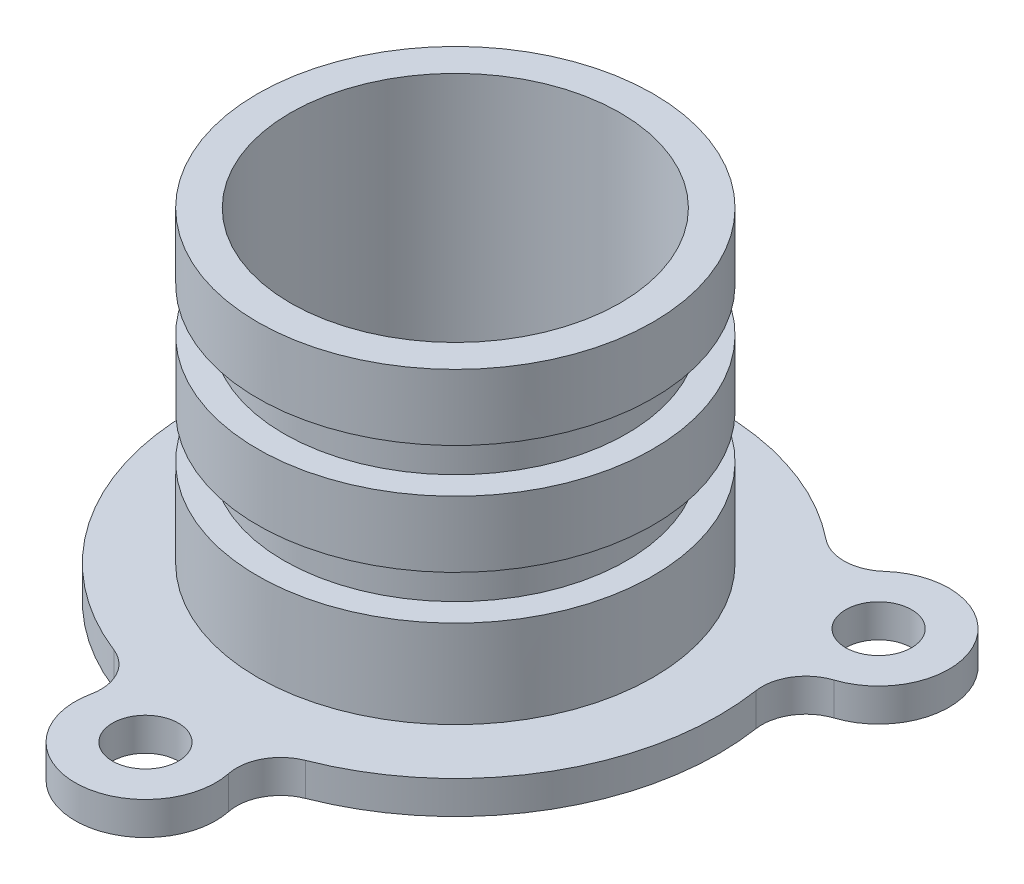
ISO-10303-21;
HEADER;
FILE_DESCRIPTION(('STEP AP214'),'2;1');
FILE_NAME('part.step','',(''),(''),'','','');
FILE_SCHEMA(('AUTOMOTIVE_DESIGN { 1 0 10303 214 1 1 1 1 }'));
ENDSEC;
DATA;
#1=APPLICATION_CONTEXT('core data for automotive mechanical design processes');
#2=APPLICATION_PROTOCOL_DEFINITION('international standard','automotive_design',2000,#1);
#3=PRODUCT_CONTEXT('',#1,'mechanical');
#4=PRODUCT('Part','Part','',(#3));
#5=PRODUCT_RELATED_PRODUCT_CATEGORY('part','',(#4));
#6=PRODUCT_DEFINITION_FORMATION('','',#4);
#7=PRODUCT_DEFINITION_CONTEXT('part definition',#1,'design');
#8=PRODUCT_DEFINITION('design','',#6,#7);
#9=PRODUCT_DEFINITION_SHAPE('','',#8);
#10=(LENGTH_UNIT() NAMED_UNIT(*) SI_UNIT(.MILLI.,.METRE.));
#11=(NAMED_UNIT(*) PLANE_ANGLE_UNIT() SI_UNIT($,.RADIAN.));
#12=(NAMED_UNIT(*) SI_UNIT($,.STERADIAN.) SOLID_ANGLE_UNIT());
#13=UNCERTAINTY_MEASURE_WITH_UNIT(LENGTH_MEASURE(1.E-05),#10,'distance_accuracy_value','');
#14=(GEOMETRIC_REPRESENTATION_CONTEXT(3) GLOBAL_UNCERTAINTY_ASSIGNED_CONTEXT((#13)) GLOBAL_UNIT_ASSIGNED_CONTEXT((#10,
#11,#12)) REPRESENTATION_CONTEXT('',''));
#15=CARTESIAN_POINT('',(0.,0.,0.));
#16=DIRECTION('',(0.,0.,1.));
#17=DIRECTION('',(1.,0.,0.));
#18=AXIS2_PLACEMENT_3D('',#15,#16,#17);
#19=CARTESIAN_POINT('',(0.,77.5,0.));
#20=DIRECTION('',(0.,-1.,0.));
#21=DIRECTION('',(0.,0.,-1.));
#22=AXIS2_PLACEMENT_3D('',#19,#20,#21);
#23=CYLINDRICAL_SURFACE('',#22,45.);
#24=CARTESIAN_POINT('',(0.,27.5,0.));
#25=DIRECTION('',(0.,-1.,0.));
#26=DIRECTION('',(0.,0.,-1.));
#27=AXIS2_PLACEMENT_3D('',#24,#25,#26);
#28=CIRCLE('',#27,45.);
#29=CARTESIAN_POINT('',(0.,27.5,-45.));
#30=VERTEX_POINT('',#29);
#31=EDGE_CURVE('E346',#30,#30,#28,.T.);
#32=ORIENTED_EDGE('',*,*,#31,.T.);
#33=EDGE_LOOP('',(#32));
#34=FACE_BOUND('',#33,.T.);
#35=CARTESIAN_POINT('',(0.,7.5,0.));
#36=DIRECTION('',(0.,1.,0.));
#37=DIRECTION('',(0.,0.,1.));
#38=AXIS2_PLACEMENT_3D('',#35,#36,#37);
#39=CIRCLE('',#38,45.);
#40=CARTESIAN_POINT('',(0.,7.5,45.));
#41=VERTEX_POINT('',#40);
#42=EDGE_CURVE('E367',#41,#41,#39,.T.);
#43=ORIENTED_EDGE('',*,*,#42,.T.);
#44=EDGE_LOOP('',(#43));
#45=FACE_BOUND('',#44,.T.);
#46=ADVANCED_FACE('F45',(#34,#45),#23,.T.);
#47=CARTESIAN_POINT('',(-12.7278128591999,7.5,32.6037234042553));
#48=DIRECTION('',(0.,1.,0.));
#49=DIRECTION('',(0.,0.,1.));
#50=AXIS2_PLACEMENT_3D('',#47,#48,#49);
#51=PLANE('',#50);
#52=ORIENTED_EDGE('',*,*,#42,.F.);
#53=EDGE_LOOP('',(#52));
#54=FACE_BOUND('',#53,.T.);
#55=CARTESIAN_POINT('',(61.0547909668029,7.5,-35.25));
#56=DIRECTION('',(0.,1.,0.));
#57=DIRECTION('',(0.,0.,1.));
#58=AXIS2_PLACEMENT_3D('',#55,#56,#57);
#59=CIRCLE('',#58,7.5);
#60=CARTESIAN_POINT('',(61.0547909668029,7.5,-27.75));
#61=VERTEX_POINT('',#60);
#62=EDGE_CURVE('E380',#61,#61,#59,.T.);
#63=ORIENTED_EDGE('',*,*,#62,.F.);
#64=EDGE_LOOP('',(#63));
#65=FACE_BOUND('',#64,.T.);
#66=CARTESIAN_POINT('',(0.,7.5,0.));
#67=DIRECTION('',(0.,1.,0.));
#68=DIRECTION('',(0.,0.,1.));
#69=AXIS2_PLACEMENT_3D('',#66,#67,#68);
#70=CIRCLE('',#69,60.);
#71=CARTESIAN_POINT('',(-59.313529981108,7.5,-9.05014702533651));
#72=VERTEX_POINT('',#71);
#73=CARTESIAN_POINT('',(-21.8191077586284,7.5,55.8920972644376));
#74=VERTEX_POINT('',#73);
#75=EDGE_CURVE('E207',#72,#74,#70,.T.);
#76=ORIENTED_EDGE('',*,*,#75,.T.);
#77=CARTESIAN_POINT('',(-25.4556257183998,7.5,65.2074468085106));
#78=DIRECTION('',(0.,-1.,0.));
#79=DIRECTION('',(0.,0.,-1.));
#80=AXIS2_PLACEMENT_3D('',#77,#78,#79);
#81=CIRCLE('',#80,9.99999999999999);
#82=CARTESIAN_POINT('',(-15.6650004420922,7.5,67.2430441898527));
#83=VERTEX_POINT('',#82);
#84=EDGE_CURVE('E118',#74,#83,#81,.T.);
#85=ORIENTED_EDGE('',*,*,#84,.T.);
#86=CARTESIAN_POINT('',(0.,7.5,70.5));
#87=DIRECTION('',(0.,1.,0.));
#88=DIRECTION('',(0.,0.,1.));
#89=AXIS2_PLACEMENT_3D('',#86,#87,#88);
#90=CIRCLE('',#89,16.);
#91=CARTESIAN_POINT('',(15.6650004420922,7.5,67.2430441898527));
#92=VERTEX_POINT('',#91);
#93=EDGE_CURVE('E244',#83,#92,#90,.T.);
#94=ORIENTED_EDGE('',*,*,#93,.T.);
#95=CARTESIAN_POINT('',(25.4556257183998,7.5,65.2074468085106));
#96=DIRECTION('',(0.,-1.,0.));
#97=DIRECTION('',(0.,0.,1.));
#98=AXIS2_PLACEMENT_3D('',#95,#96,#97);
#99=CIRCLE('',#98,10.);
#100=CARTESIAN_POINT('',(21.8191077586284,7.5,55.8920972644377));
#101=VERTEX_POINT('',#100);
#102=EDGE_CURVE('E264',#92,#101,#99,.T.);
#103=ORIENTED_EDGE('',*,*,#102,.T.);
#104=CARTESIAN_POINT('',(0.,7.5,0.));
#105=DIRECTION('',(0.,1.,0.));
#106=DIRECTION('',(0.,0.,1.));
#107=AXIS2_PLACEMENT_3D('',#104,#105,#106);
#108=CIRCLE('',#107,60.);
#109=CARTESIAN_POINT('',(59.3135299811079,7.5,-9.05014702533651));
#110=VERTEX_POINT('',#109);
#111=EDGE_CURVE('E260',#101,#110,#108,.T.);
#112=ORIENTED_EDGE('',*,*,#111,.T.);
#113=CARTESIAN_POINT('',(69.1991183112926,7.5,-10.5585048628926));
#114=DIRECTION('',(0.,-1.,0.));
#115=DIRECTION('',(0.,0.,-1.));
#116=AXIS2_PLACEMENT_3D('',#113,#114,#115);
#117=CIRCLE('',#116,10.);
#118=CARTESIAN_POINT('',(66.0666847172581,7.5,-20.0552337617801));
#119=VERTEX_POINT('',#118);
#120=EDGE_CURVE('E263',#110,#119,#117,.T.);
#121=ORIENTED_EDGE('',*,*,#120,.T.);
#122=CARTESIAN_POINT('',(61.0547909668029,7.5,-35.25));
#123=DIRECTION('',(0.,1.,0.));
#124=DIRECTION('',(0.,0.,1.));
#125=AXIS2_PLACEMENT_3D('',#122,#123,#124);
#126=CIRCLE('',#125,16.);
#127=CARTESIAN_POINT('',(50.401684275166,7.5,-47.1878104280726));
#128=VERTEX_POINT('',#127);
#129=EDGE_CURVE('E268',#119,#128,#126,.T.);
#130=ORIENTED_EDGE('',*,*,#129,.T.);
#131=CARTESIAN_POINT('',(43.7434925928929,7.5,-54.648941945618));
#132=DIRECTION('',(0.,-1.,0.));
#133=DIRECTION('',(0.,0.,1.));
#134=AXIS2_PLACEMENT_3D('',#131,#132,#133);
#135=CIRCLE('',#134,10.);
#136=CARTESIAN_POINT('',(37.4944222224796,7.5,-46.8419502391012));
#137=VERTEX_POINT('',#136);
#138=EDGE_CURVE('E275',#128,#137,#135,.T.);
#139=ORIENTED_EDGE('',*,*,#138,.T.);
#140=CARTESIAN_POINT('',(0.,7.5,0.));
#141=DIRECTION('',(0.,1.,0.));
#142=DIRECTION('',(0.,0.,1.));
#143=AXIS2_PLACEMENT_3D('',#140,#141,#142);
#144=CIRCLE('',#143,60.);
#145=CARTESIAN_POINT('',(-37.4944222224796,7.5,-46.8419502391011));
#146=VERTEX_POINT('',#145);
#147=EDGE_CURVE('E150',#137,#146,#144,.T.);
#148=ORIENTED_EDGE('',*,*,#147,.T.);
#149=CARTESIAN_POINT('',(-43.7434925928929,7.5,-54.648941945618));
#150=DIRECTION('',(0.,-1.,0.));
#151=DIRECTION('',(0.,0.,-1.));
#152=AXIS2_PLACEMENT_3D('',#149,#150,#151);
#153=CIRCLE('',#152,10.);
#154=CARTESIAN_POINT('',(-50.401684275166,7.5,-47.1878104280726));
#155=VERTEX_POINT('',#154);
#156=EDGE_CURVE('E143',#146,#155,#153,.T.);
#157=ORIENTED_EDGE('',*,*,#156,.T.);
#158=CARTESIAN_POINT('',(-61.0547909668029,7.5,-35.25));
#159=DIRECTION('',(0.,1.,0.));
#160=DIRECTION('',(0.,0.,1.));
#161=AXIS2_PLACEMENT_3D('',#158,#159,#160);
#162=CIRCLE('',#161,16.);
#163=CARTESIAN_POINT('',(-66.0666847172581,7.5,-20.0552337617801));
#164=VERTEX_POINT('',#163);
#165=EDGE_CURVE('E148',#155,#164,#162,.T.);
#166=ORIENTED_EDGE('',*,*,#165,.T.);
#167=CARTESIAN_POINT('',(-69.1991183112926,7.5,-10.5585048628926));
#168=DIRECTION('',(0.,-1.,0.));
#169=DIRECTION('',(0.,0.,1.));
#170=AXIS2_PLACEMENT_3D('',#167,#168,#169);
#171=CIRCLE('',#170,10.);
#172=EDGE_CURVE('E63',#164,#72,#171,.T.);
#173=ORIENTED_EDGE('',*,*,#172,.T.);
#174=EDGE_LOOP('',(#76,#85,#94,#103,#112,#121,#130,#139,#148,#157,#166,#173));
#175=FACE_BOUND('',#174,.T.);
#176=CARTESIAN_POINT('',(-61.0547909668029,7.5,-35.25));
#177=DIRECTION('',(0.,1.,0.));
#178=DIRECTION('',(0.,0.,1.));
#179=AXIS2_PLACEMENT_3D('',#176,#177,#178);
#180=CIRCLE('',#179,7.5);
#181=CARTESIAN_POINT('',(-61.0547909668029,7.5,-27.75));
#182=VERTEX_POINT('',#181);
#183=EDGE_CURVE('E177',#182,#182,#180,.T.);
#184=ORIENTED_EDGE('',*,*,#183,.F.);
#185=EDGE_LOOP('',(#184));
#186=FACE_BOUND('',#185,.T.);
#187=CARTESIAN_POINT('',(0.,7.5,70.5));
#188=DIRECTION('',(0.,1.,0.));
#189=DIRECTION('',(0.,0.,1.));
#190=AXIS2_PLACEMENT_3D('',#187,#188,#189);
#191=CIRCLE('',#190,7.5);
#192=CARTESIAN_POINT('',(0.,7.5,78.));
#193=VERTEX_POINT('',#192);
#194=EDGE_CURVE('E372',#193,#193,#191,.T.);
#195=ORIENTED_EDGE('',*,*,#194,.F.);
#196=EDGE_LOOP('',(#195));
#197=FACE_BOUND('',#196,.T.);
#198=ADVANCED_FACE('F145',(#54,#65,#175,#186,#197),#51,.T.);
#199=CARTESIAN_POINT('',(-12.7278128591999,0.,32.6037234042553));
#200=DIRECTION('',(0.,1.,0.));
#201=DIRECTION('',(0.,0.,1.));
#202=AXIS2_PLACEMENT_3D('',#199,#200,#201);
#203=PLANE('',#202);
#204=CARTESIAN_POINT('',(0.,0.,0.));
#205=DIRECTION('',(0.,1.,0.));
#206=DIRECTION('',(0.,0.,1.));
#207=AXIS2_PLACEMENT_3D('',#204,#205,#206);
#208=CIRCLE('',#207,37.5);
#209=CARTESIAN_POINT('',(0.,0.,37.5));
#210=VERTEX_POINT('',#209);
#211=EDGE_CURVE('E354',#210,#210,#208,.T.);
#212=ORIENTED_EDGE('',*,*,#211,.T.);
#213=EDGE_LOOP('',(#212));
#214=FACE_BOUND('',#213,.T.);
#215=CARTESIAN_POINT('',(0.,0.,0.));
#216=DIRECTION('',(0.,1.,0.));
#217=DIRECTION('',(0.,0.,1.));
#218=AXIS2_PLACEMENT_3D('',#215,#216,#217);
#219=CIRCLE('',#218,60.);
#220=CARTESIAN_POINT('',(-59.313529981108,0.,-9.05014702533651));
#221=VERTEX_POINT('',#220);
#222=CARTESIAN_POINT('',(-21.8191077586284,0.,55.8920972644376));
#223=VERTEX_POINT('',#222);
#224=EDGE_CURVE('E172',#221,#223,#219,.T.);
#225=ORIENTED_EDGE('',*,*,#224,.F.);
#226=CARTESIAN_POINT('',(-69.1991183112926,0.,-10.5585048628926));
#227=DIRECTION('',(0.,-1.,0.));
#228=DIRECTION('',(0.,0.,1.));
#229=AXIS2_PLACEMENT_3D('',#226,#227,#228);
#230=CIRCLE('',#229,10.);
#231=CARTESIAN_POINT('',(-66.0666847172581,0.,-20.0552337617801));
#232=VERTEX_POINT('',#231);
#233=EDGE_CURVE('E110',#232,#221,#230,.T.);
#234=ORIENTED_EDGE('',*,*,#233,.F.);
#235=CARTESIAN_POINT('',(-61.0547909668029,0.,-35.25));
#236=DIRECTION('',(0.,1.,0.));
#237=DIRECTION('',(0.,0.,1.));
#238=AXIS2_PLACEMENT_3D('',#235,#236,#237);
#239=CIRCLE('',#238,16.);
#240=CARTESIAN_POINT('',(-50.401684275166,0.,-47.1878104280726));
#241=VERTEX_POINT('',#240);
#242=EDGE_CURVE('E104',#241,#232,#239,.T.);
#243=ORIENTED_EDGE('',*,*,#242,.F.);
#244=CARTESIAN_POINT('',(-43.7434925928929,0.,-54.648941945618));
#245=DIRECTION('',(0.,-1.,0.));
#246=DIRECTION('',(0.,0.,-1.));
#247=AXIS2_PLACEMENT_3D('',#244,#245,#246);
#248=CIRCLE('',#247,10.);
#249=CARTESIAN_POINT('',(-37.4944222224796,0.,-46.8419502391011));
#250=VERTEX_POINT('',#249);
#251=EDGE_CURVE('E159',#250,#241,#248,.T.);
#252=ORIENTED_EDGE('',*,*,#251,.F.);
#253=CARTESIAN_POINT('',(0.,0.,0.));
#254=DIRECTION('',(0.,1.,0.));
#255=DIRECTION('',(0.,0.,1.));
#256=AXIS2_PLACEMENT_3D('',#253,#254,#255);
#257=CIRCLE('',#256,60.);
#258=CARTESIAN_POINT('',(37.4944222224796,0.,-46.8419502391012));
#259=VERTEX_POINT('',#258);
#260=EDGE_CURVE('E198',#259,#250,#257,.T.);
#261=ORIENTED_EDGE('',*,*,#260,.F.);
#262=CARTESIAN_POINT('',(43.7434925928929,0.,-54.648941945618));
#263=DIRECTION('',(0.,-1.,0.));
#264=DIRECTION('',(0.,0.,1.));
#265=AXIS2_PLACEMENT_3D('',#262,#263,#264);
#266=CIRCLE('',#265,10.);
#267=CARTESIAN_POINT('',(50.401684275166,0.,-47.1878104280726));
#268=VERTEX_POINT('',#267);
#269=EDGE_CURVE('E195',#268,#259,#266,.T.);
#270=ORIENTED_EDGE('',*,*,#269,.F.);
#271=CARTESIAN_POINT('',(61.0547909668029,0.,-35.25));
#272=DIRECTION('',(0.,1.,0.));
#273=DIRECTION('',(0.,0.,1.));
#274=AXIS2_PLACEMENT_3D('',#271,#272,#273);
#275=CIRCLE('',#274,16.);
#276=CARTESIAN_POINT('',(66.0666847172581,0.,-20.0552337617801));
#277=VERTEX_POINT('',#276);
#278=EDGE_CURVE('E192',#277,#268,#275,.T.);
#279=ORIENTED_EDGE('',*,*,#278,.F.);
#280=CARTESIAN_POINT('',(69.1991183112926,0.,-10.5585048628926));
#281=DIRECTION('',(0.,-1.,0.));
#282=DIRECTION('',(0.,0.,-1.));
#283=AXIS2_PLACEMENT_3D('',#280,#281,#282);
#284=CIRCLE('',#283,10.);
#285=CARTESIAN_POINT('',(59.3135299811079,0.,-9.05014702533651));
#286=VERTEX_POINT('',#285);
#287=EDGE_CURVE('E189',#286,#277,#284,.T.);
#288=ORIENTED_EDGE('',*,*,#287,.F.);
#289=CARTESIAN_POINT('',(0.,0.,0.));
#290=DIRECTION('',(0.,1.,0.));
#291=DIRECTION('',(0.,0.,1.));
#292=AXIS2_PLACEMENT_3D('',#289,#290,#291);
#293=CIRCLE('',#292,60.);
#294=CARTESIAN_POINT('',(21.8191077586284,0.,55.8920972644377));
#295=VERTEX_POINT('',#294);
#296=EDGE_CURVE('E186',#295,#286,#293,.T.);
#297=ORIENTED_EDGE('',*,*,#296,.F.);
#298=CARTESIAN_POINT('',(25.4556257183998,0.,65.2074468085106));
#299=DIRECTION('',(0.,-1.,0.));
#300=DIRECTION('',(0.,0.,1.));
#301=AXIS2_PLACEMENT_3D('',#298,#299,#300);
#302=CIRCLE('',#301,10.);
#303=CARTESIAN_POINT('',(15.6650004420922,0.,67.2430441898527));
#304=VERTEX_POINT('',#303);
#305=EDGE_CURVE('E183',#304,#295,#302,.T.);
#306=ORIENTED_EDGE('',*,*,#305,.F.);
#307=CARTESIAN_POINT('',(0.,0.,70.5));
#308=DIRECTION('',(0.,1.,0.));
#309=DIRECTION('',(0.,0.,1.));
#310=AXIS2_PLACEMENT_3D('',#307,#308,#309);
#311=CIRCLE('',#310,16.);
#312=CARTESIAN_POINT('',(-15.6650004420922,0.,67.2430441898527));
#313=VERTEX_POINT('',#312);
#314=EDGE_CURVE('E180',#313,#304,#311,.T.);
#315=ORIENTED_EDGE('',*,*,#314,.F.);
#316=CARTESIAN_POINT('',(-25.4556257183998,0.,65.2074468085106));
#317=DIRECTION('',(0.,-1.,0.));
#318=DIRECTION('',(0.,0.,-1.));
#319=AXIS2_PLACEMENT_3D('',#316,#317,#318);
#320=CIRCLE('',#319,9.99999999999999);
#321=EDGE_CURVE('E176',#223,#313,#320,.T.);
#322=ORIENTED_EDGE('',*,*,#321,.F.);
#323=EDGE_LOOP('',(#225,#234,#243,#252,#261,#270,#279,#288,#297,#306,#315,#322));
#324=FACE_BOUND('',#323,.T.);
#325=CARTESIAN_POINT('',(-61.0547909668029,0.,-35.25));
#326=DIRECTION('',(0.,1.,0.));
#327=DIRECTION('',(0.,0.,1.));
#328=AXIS2_PLACEMENT_3D('',#325,#326,#327);
#329=CIRCLE('',#328,7.5);
#330=CARTESIAN_POINT('',(-61.0547909668029,0.,-27.75));
#331=VERTEX_POINT('',#330);
#332=EDGE_CURVE('E384',#331,#331,#329,.T.);
#333=ORIENTED_EDGE('',*,*,#332,.T.);
#334=EDGE_LOOP('',(#333));
#335=FACE_BOUND('',#334,.T.);
#336=CARTESIAN_POINT('',(61.0547909668029,0.,-35.25));
#337=DIRECTION('',(0.,1.,0.));
#338=DIRECTION('',(0.,0.,1.));
#339=AXIS2_PLACEMENT_3D('',#336,#337,#338);
#340=CIRCLE('',#339,7.5);
#341=CARTESIAN_POINT('',(61.0547909668029,0.,-27.75));
#342=VERTEX_POINT('',#341);
#343=EDGE_CURVE('E376',#342,#342,#340,.T.);
#344=ORIENTED_EDGE('',*,*,#343,.T.);
#345=EDGE_LOOP('',(#344));
#346=FACE_BOUND('',#345,.T.);
#347=CARTESIAN_POINT('',(0.,0.,70.5));
#348=DIRECTION('',(0.,1.,0.));
#349=DIRECTION('',(0.,0.,1.));
#350=AXIS2_PLACEMENT_3D('',#347,#348,#349);
#351=CIRCLE('',#350,7.5);
#352=CARTESIAN_POINT('',(0.,0.,78.));
#353=VERTEX_POINT('',#352);
#354=EDGE_CURVE('E366',#353,#353,#351,.T.);
#355=ORIENTED_EDGE('',*,*,#354,.T.);
#356=EDGE_LOOP('',(#355));
#357=FACE_BOUND('',#356,.T.);
#358=ADVANCED_FACE('F248',(#214,#324,#335,#346,#357),#203,.F.);
#359=CARTESIAN_POINT('',(0.,7.5,0.));
#360=DIRECTION('',(0.,-1.,0.));
#361=DIRECTION('',(0.,0.,-1.));
#362=AXIS2_PLACEMENT_3D('',#359,#360,#361);
#363=CYLINDRICAL_SURFACE('',#362,60.);
#364=ORIENTED_EDGE('',*,*,#224,.T.);
#365=DIRECTION('',(0.,-1.,0.));
#366=VECTOR('',#365,1.);
#367=CARTESIAN_POINT('',(-21.8191077586284,7.5,55.8920972644376));
#368=LINE('',#367,#366);
#369=EDGE_CURVE('E11',#74,#223,#368,.T.);
#370=ORIENTED_EDGE('',*,*,#369,.F.);
#371=ORIENTED_EDGE('',*,*,#75,.F.);
#372=DIRECTION('',(0.,-1.,0.));
#373=VECTOR('',#372,1.);
#374=CARTESIAN_POINT('',(-59.313529981108,7.5,-9.05014702533651));
#375=LINE('',#374,#373);
#376=EDGE_CURVE('E168',#72,#221,#375,.T.);
#377=ORIENTED_EDGE('',*,*,#376,.T.);
#378=EDGE_LOOP('',(#364,#370,#371,#377));
#379=FACE_BOUND('',#378,.T.);
#380=ADVANCED_FACE('F47',(#379),#363,.T.);
#381=CARTESIAN_POINT('',(-25.4556257183998,7.5,65.2074468085106));
#382=DIRECTION('',(0.,-1.,0.));
#383=DIRECTION('',(0.,0.,-1.));
#384=AXIS2_PLACEMENT_3D('',#381,#382,#383);
#385=CYLINDRICAL_SURFACE('',#384,9.99999999999999);
#386=ORIENTED_EDGE('',*,*,#321,.T.);
#387=DIRECTION('',(0.,-1.,0.));
#388=VECTOR('',#387,1.);
#389=CARTESIAN_POINT('',(-15.6650004420922,7.5,67.2430441898527));
#390=LINE('',#389,#388);
#391=EDGE_CURVE('E55',#83,#313,#390,.T.);
#392=ORIENTED_EDGE('',*,*,#391,.F.);
#393=ORIENTED_EDGE('',*,*,#84,.F.);
#394=ORIENTED_EDGE('',*,*,#369,.T.);
#395=EDGE_LOOP('',(#386,#392,#393,#394));
#396=FACE_BOUND('',#395,.T.);
#397=ADVANCED_FACE('F452',(#396),#385,.F.);
#398=CARTESIAN_POINT('',(0.,7.5,70.5));
#399=DIRECTION('',(0.,-1.,0.));
#400=DIRECTION('',(0.,0.,-1.));
#401=AXIS2_PLACEMENT_3D('',#398,#399,#400);
#402=CYLINDRICAL_SURFACE('',#401,16.);
#403=ORIENTED_EDGE('',*,*,#314,.T.);
#404=DIRECTION('',(0.,-1.,0.));
#405=VECTOR('',#404,1.);
#406=CARTESIAN_POINT('',(15.6650004420922,7.5,67.2430441898527));
#407=LINE('',#406,#405);
#408=EDGE_CURVE('E234',#92,#304,#407,.T.);
#409=ORIENTED_EDGE('',*,*,#408,.F.);
#410=ORIENTED_EDGE('',*,*,#93,.F.);
#411=ORIENTED_EDGE('',*,*,#391,.T.);
#412=EDGE_LOOP('',(#403,#409,#410,#411));
#413=FACE_BOUND('',#412,.T.);
#414=ADVANCED_FACE('F242',(#413),#402,.T.);
#415=CARTESIAN_POINT('',(25.4556257183998,7.5,65.2074468085106));
#416=DIRECTION('',(0.,-1.,0.));
#417=DIRECTION('',(0.,0.,-1.));
#418=AXIS2_PLACEMENT_3D('',#415,#416,#417);
#419=CYLINDRICAL_SURFACE('',#418,10.);
#420=ORIENTED_EDGE('',*,*,#305,.T.);
#421=DIRECTION('',(0.,-1.,0.));
#422=VECTOR('',#421,1.);
#423=CARTESIAN_POINT('',(21.8191077586284,7.5,55.8920972644377));
#424=LINE('',#423,#422);
#425=EDGE_CURVE('E230',#101,#295,#424,.T.);
#426=ORIENTED_EDGE('',*,*,#425,.F.);
#427=ORIENTED_EDGE('',*,*,#102,.F.);
#428=ORIENTED_EDGE('',*,*,#408,.T.);
#429=EDGE_LOOP('',(#420,#426,#427,#428));
#430=FACE_BOUND('',#429,.T.);
#431=ADVANCED_FACE('F254',(#430),#419,.F.);
#432=CARTESIAN_POINT('',(0.,7.5,0.));
#433=DIRECTION('',(0.,-1.,0.));
#434=DIRECTION('',(0.,0.,-1.));
#435=AXIS2_PLACEMENT_3D('',#432,#433,#434);
#436=CYLINDRICAL_SURFACE('',#435,60.);
#437=ORIENTED_EDGE('',*,*,#296,.T.);
#438=DIRECTION('',(0.,-1.,0.));
#439=VECTOR('',#438,1.);
#440=CARTESIAN_POINT('',(59.3135299811079,7.5,-9.05014702533651));
#441=LINE('',#440,#439);
#442=EDGE_CURVE('E226',#110,#286,#441,.T.);
#443=ORIENTED_EDGE('',*,*,#442,.F.);
#444=ORIENTED_EDGE('',*,*,#111,.F.);
#445=ORIENTED_EDGE('',*,*,#425,.T.);
#446=EDGE_LOOP('',(#437,#443,#444,#445));
#447=FACE_BOUND('',#446,.T.);
#448=ADVANCED_FACE('F258',(#447),#436,.T.);
#449=CARTESIAN_POINT('',(69.1991183112926,7.5,-10.5585048628926));
#450=DIRECTION('',(0.,-1.,0.));
#451=DIRECTION('',(0.,0.,-1.));
#452=AXIS2_PLACEMENT_3D('',#449,#450,#451);
#453=CYLINDRICAL_SURFACE('',#452,10.);
#454=ORIENTED_EDGE('',*,*,#287,.T.);
#455=DIRECTION('',(0.,-1.,0.));
#456=VECTOR('',#455,1.);
#457=CARTESIAN_POINT('',(66.0666847172581,7.5,-20.0552337617801));
#458=LINE('',#457,#456);
#459=EDGE_CURVE('E222',#119,#277,#458,.T.);
#460=ORIENTED_EDGE('',*,*,#459,.F.);
#461=ORIENTED_EDGE('',*,*,#120,.F.);
#462=ORIENTED_EDGE('',*,*,#442,.T.);
#463=EDGE_LOOP('',(#454,#460,#461,#462));
#464=FACE_BOUND('',#463,.T.);
#465=ADVANCED_FACE('F516',(#464),#453,.F.);
#466=CARTESIAN_POINT('',(61.0547909668029,7.5,-35.25));
#467=DIRECTION('',(0.,-1.,0.));
#468=DIRECTION('',(0.,0.,-1.));
#469=AXIS2_PLACEMENT_3D('',#466,#467,#468);
#470=CYLINDRICAL_SURFACE('',#469,16.);
#471=ORIENTED_EDGE('',*,*,#278,.T.);
#472=DIRECTION('',(0.,-1.,0.));
#473=VECTOR('',#472,1.);
#474=CARTESIAN_POINT('',(50.401684275166,7.5,-47.1878104280726));
#475=LINE('',#474,#473);
#476=EDGE_CURVE('E218',#128,#268,#475,.T.);
#477=ORIENTED_EDGE('',*,*,#476,.F.);
#478=ORIENTED_EDGE('',*,*,#129,.F.);
#479=ORIENTED_EDGE('',*,*,#459,.T.);
#480=EDGE_LOOP('',(#471,#477,#478,#479));
#481=FACE_BOUND('',#480,.T.);
#482=ADVANCED_FACE('F525',(#481),#470,.T.);
#483=CARTESIAN_POINT('',(43.7434925928929,7.5,-54.648941945618));
#484=DIRECTION('',(0.,-1.,0.));
#485=DIRECTION('',(0.,0.,-1.));
#486=AXIS2_PLACEMENT_3D('',#483,#484,#485);
#487=CYLINDRICAL_SURFACE('',#486,10.);
#488=ORIENTED_EDGE('',*,*,#269,.T.);
#489=DIRECTION('',(0.,-1.,0.));
#490=VECTOR('',#489,1.);
#491=CARTESIAN_POINT('',(37.4944222224796,7.5,-46.8419502391012));
#492=LINE('',#491,#490);
#493=EDGE_CURVE('E214',#137,#259,#492,.T.);
#494=ORIENTED_EDGE('',*,*,#493,.F.);
#495=ORIENTED_EDGE('',*,*,#138,.F.);
#496=ORIENTED_EDGE('',*,*,#476,.T.);
#497=EDGE_LOOP('',(#488,#494,#495,#496));
#498=FACE_BOUND('',#497,.T.);
#499=ADVANCED_FACE('F283',(#498),#487,.F.);
#500=CARTESIAN_POINT('',(0.,7.5,0.));
#501=DIRECTION('',(0.,-1.,0.));
#502=DIRECTION('',(0.,0.,-1.));
#503=AXIS2_PLACEMENT_3D('',#500,#501,#502);
#504=CYLINDRICAL_SURFACE('',#503,60.);
#505=ORIENTED_EDGE('',*,*,#260,.T.);
#506=DIRECTION('',(0.,-1.,0.));
#507=VECTOR('',#506,1.);
#508=CARTESIAN_POINT('',(-37.4944222224796,7.5,-46.8419502391011));
#509=LINE('',#508,#507);
#510=EDGE_CURVE('E161',#146,#250,#509,.T.);
#511=ORIENTED_EDGE('',*,*,#510,.F.);
#512=ORIENTED_EDGE('',*,*,#147,.F.);
#513=ORIENTED_EDGE('',*,*,#493,.T.);
#514=EDGE_LOOP('',(#505,#511,#512,#513));
#515=FACE_BOUND('',#514,.T.);
#516=ADVANCED_FACE('F287',(#515),#504,.T.);
#517=CARTESIAN_POINT('',(-43.7434925928929,7.5,-54.648941945618));
#518=DIRECTION('',(0.,-1.,0.));
#519=DIRECTION('',(0.,0.,-1.));
#520=AXIS2_PLACEMENT_3D('',#517,#518,#519);
#521=CYLINDRICAL_SURFACE('',#520,10.);
#522=ORIENTED_EDGE('',*,*,#251,.T.);
#523=DIRECTION('',(0.,-1.,0.));
#524=VECTOR('',#523,1.);
#525=CARTESIAN_POINT('',(-50.401684275166,7.5,-47.1878104280726));
#526=LINE('',#525,#524);
#527=EDGE_CURVE('E156',#155,#241,#526,.T.);
#528=ORIENTED_EDGE('',*,*,#527,.F.);
#529=ORIENTED_EDGE('',*,*,#156,.F.);
#530=ORIENTED_EDGE('',*,*,#510,.T.);
#531=EDGE_LOOP('',(#522,#528,#529,#530));
#532=FACE_BOUND('',#531,.T.);
#533=ADVANCED_FACE('F157',(#532),#521,.F.);
#534=CARTESIAN_POINT('',(-61.0547909668029,7.5,-35.25));
#535=DIRECTION('',(0.,-1.,0.));
#536=DIRECTION('',(0.,0.,-1.));
#537=AXIS2_PLACEMENT_3D('',#534,#535,#536);
#538=CYLINDRICAL_SURFACE('',#537,16.);
#539=ORIENTED_EDGE('',*,*,#242,.T.);
#540=DIRECTION('',(0.,-1.,0.));
#541=VECTOR('',#540,1.);
#542=CARTESIAN_POINT('',(-66.0666847172581,7.5,-20.0552337617801));
#543=LINE('',#542,#541);
#544=EDGE_CURVE('E162',#164,#232,#543,.T.);
#545=ORIENTED_EDGE('',*,*,#544,.F.);
#546=ORIENTED_EDGE('',*,*,#165,.F.);
#547=ORIENTED_EDGE('',*,*,#527,.T.);
#548=EDGE_LOOP('',(#539,#545,#546,#547));
#549=FACE_BOUND('',#548,.T.);
#550=ADVANCED_FACE('F164',(#549),#538,.T.);
#551=CARTESIAN_POINT('',(-69.1991183112926,7.5,-10.5585048628926));
#552=DIRECTION('',(0.,-1.,0.));
#553=DIRECTION('',(0.,0.,-1.));
#554=AXIS2_PLACEMENT_3D('',#551,#552,#553);
#555=CYLINDRICAL_SURFACE('',#554,10.);
#556=ORIENTED_EDGE('',*,*,#233,.T.);
#557=ORIENTED_EDGE('',*,*,#376,.F.);
#558=ORIENTED_EDGE('',*,*,#172,.F.);
#559=ORIENTED_EDGE('',*,*,#544,.T.);
#560=EDGE_LOOP('',(#556,#557,#558,#559));
#561=FACE_BOUND('',#560,.T.);
#562=ADVANCED_FACE('F291',(#561),#555,.F.);
#563=CARTESIAN_POINT('',(-61.0547909668029,7.5,-35.25));
#564=DIRECTION('',(0.,-1.,0.));
#565=DIRECTION('',(0.,0.,-1.));
#566=AXIS2_PLACEMENT_3D('',#563,#564,#565);
#567=CYLINDRICAL_SURFACE('',#566,7.5);
#568=ORIENTED_EDGE('',*,*,#183,.T.);
#569=EDGE_LOOP('',(#568));
#570=FACE_BOUND('',#569,.T.);
#571=ORIENTED_EDGE('',*,*,#332,.F.);
#572=EDGE_LOOP('',(#571));
#573=FACE_BOUND('',#572,.T.);
#574=ADVANCED_FACE('F293',(#570,#573),#567,.F.);
#575=CARTESIAN_POINT('',(61.0547909668029,7.5,-35.25));
#576=DIRECTION('',(0.,-1.,0.));
#577=DIRECTION('',(0.,0.,-1.));
#578=AXIS2_PLACEMENT_3D('',#575,#576,#577);
#579=CYLINDRICAL_SURFACE('',#578,7.5);
#580=ORIENTED_EDGE('',*,*,#62,.T.);
#581=EDGE_LOOP('',(#580));
#582=FACE_BOUND('',#581,.T.);
#583=ORIENTED_EDGE('',*,*,#343,.F.);
#584=EDGE_LOOP('',(#583));
#585=FACE_BOUND('',#584,.T.);
#586=ADVANCED_FACE('F299',(#582,#585),#579,.F.);
#587=CARTESIAN_POINT('',(0.,7.5,70.5));
#588=DIRECTION('',(0.,-1.,0.));
#589=DIRECTION('',(0.,0.,-1.));
#590=AXIS2_PLACEMENT_3D('',#587,#588,#589);
#591=CYLINDRICAL_SURFACE('',#590,7.5);
#592=ORIENTED_EDGE('',*,*,#194,.T.);
#593=EDGE_LOOP('',(#592));
#594=FACE_BOUND('',#593,.T.);
#595=ORIENTED_EDGE('',*,*,#354,.F.);
#596=EDGE_LOOP('',(#595));
#597=FACE_BOUND('',#596,.T.);
#598=ADVANCED_FACE('F436',(#594,#597),#591,.F.);
#599=CARTESIAN_POINT('',(0.,0.,0.));
#600=DIRECTION('',(0.,-1.,0.));
#601=DIRECTION('',(0.,0.,-1.));
#602=AXIS2_PLACEMENT_3D('',#599,#600,#601);
#603=CYLINDRICAL_SURFACE('',#602,39.);
#604=CARTESIAN_POINT('',(0.,27.5,0.));
#605=DIRECTION('',(0.,-1.,0.));
#606=DIRECTION('',(0.,0.,-1.));
#607=AXIS2_PLACEMENT_3D('',#604,#605,#606);
#608=CIRCLE('',#607,39.);
#609=CARTESIAN_POINT('',(0.,27.5,-39.));
#610=VERTEX_POINT('',#609);
#611=EDGE_CURVE('E351',#610,#610,#608,.T.);
#612=ORIENTED_EDGE('',*,*,#611,.F.);
#613=EDGE_LOOP('',(#612));
#614=FACE_BOUND('',#613,.T.);
#615=CARTESIAN_POINT('',(0.,37.5,0.));
#616=DIRECTION('',(0.,-1.,0.));
#617=DIRECTION('',(0.,0.,-1.));
#618=AXIS2_PLACEMENT_3D('',#615,#616,#617);
#619=CIRCLE('',#618,39.);
#620=CARTESIAN_POINT('',(0.,37.5,-39.));
#621=VERTEX_POINT('',#620);
#622=EDGE_CURVE('E347',#621,#621,#619,.T.);
#623=ORIENTED_EDGE('',*,*,#622,.T.);
#624=EDGE_LOOP('',(#623));
#625=FACE_BOUND('',#624,.T.);
#626=ADVANCED_FACE('F434',(#614,#625),#603,.T.);
#627=CARTESIAN_POINT('',(39.,27.5,0.));
#628=DIRECTION('',(0.,-1.,0.));
#629=DIRECTION('',(0.,0.,-1.));
#630=AXIS2_PLACEMENT_3D('',#627,#628,#629);
#631=PLANE('',#630);
#632=ORIENTED_EDGE('',*,*,#31,.F.);
#633=EDGE_LOOP('',(#632));
#634=FACE_BOUND('',#633,.T.);
#635=ORIENTED_EDGE('',*,*,#611,.T.);
#636=EDGE_LOOP('',(#635));
#637=FACE_BOUND('',#636,.T.);
#638=ADVANCED_FACE('F334',(#634,#637),#631,.F.);
#639=CARTESIAN_POINT('',(39.,37.5,0.));
#640=DIRECTION('',(0.,1.,0.));
#641=DIRECTION('',(0.,0.,1.));
#642=AXIS2_PLACEMENT_3D('',#639,#640,#641);
#643=PLANE('',#642);
#644=ORIENTED_EDGE('',*,*,#622,.F.);
#645=EDGE_LOOP('',(#644));
#646=FACE_BOUND('',#645,.T.);
#647=CARTESIAN_POINT('',(0.,37.5,0.));
#648=DIRECTION('',(0.,-1.,0.));
#649=DIRECTION('',(0.,0.,-1.));
#650=AXIS2_PLACEMENT_3D('',#647,#648,#649);
#651=CIRCLE('',#650,45.);
#652=CARTESIAN_POINT('',(0.,37.5,-45.));
#653=VERTEX_POINT('',#652);
#654=EDGE_CURVE('E343',#653,#653,#651,.T.);
#655=ORIENTED_EDGE('',*,*,#654,.T.);
#656=EDGE_LOOP('',(#655));
#657=FACE_BOUND('',#656,.T.);
#658=ADVANCED_FACE('F325',(#646,#657),#643,.F.);
#659=CARTESIAN_POINT('',(0.,52.5,0.));
#660=DIRECTION('',(0.,-1.,0.));
#661=DIRECTION('',(0.,0.,-1.));
#662=AXIS2_PLACEMENT_3D('',#659,#660,#661);
#663=CIRCLE('',#662,45.);
#664=CARTESIAN_POINT('',(0.,52.5,-45.));
#665=VERTEX_POINT('',#664);
#666=EDGE_CURVE('E340',#665,#665,#663,.T.);
#667=ORIENTED_EDGE('',*,*,#666,.T.);
#668=EDGE_LOOP('',(#667));
#669=FACE_BOUND('',#668,.T.);
#670=ORIENTED_EDGE('',*,*,#654,.F.);
#671=EDGE_LOOP('',(#670));
#672=FACE_BOUND('',#671,.T.);
#673=ADVANCED_FACE('F308',(#669,#672),#23,.T.);
#674=CARTESIAN_POINT('',(0.,0.,0.));
#675=DIRECTION('',(0.,-1.,0.));
#676=DIRECTION('',(0.,0.,-1.));
#677=AXIS2_PLACEMENT_3D('',#674,#675,#676);
#678=CYLINDRICAL_SURFACE('',#677,39.);
#679=CARTESIAN_POINT('',(0.,52.5,0.));
#680=DIRECTION('',(0.,-1.,0.));
#681=DIRECTION('',(0.,0.,-1.));
#682=AXIS2_PLACEMENT_3D('',#679,#680,#681);
#683=CIRCLE('',#682,39.);
#684=CARTESIAN_POINT('',(0.,52.5,-39.));
#685=VERTEX_POINT('',#684);
#686=EDGE_CURVE('E371',#685,#685,#683,.T.);
#687=ORIENTED_EDGE('',*,*,#686,.F.);
#688=EDGE_LOOP('',(#687));
#689=FACE_BOUND('',#688,.T.);
#690=CARTESIAN_POINT('',(0.,62.5,0.));
#691=DIRECTION('',(0.,-1.,0.));
#692=DIRECTION('',(0.,0.,-1.));
#693=AXIS2_PLACEMENT_3D('',#690,#691,#692);
#694=CIRCLE('',#693,39.);
#695=CARTESIAN_POINT('',(0.,62.5,-39.));
#696=VERTEX_POINT('',#695);
#697=EDGE_CURVE('E361',#696,#696,#694,.T.);
#698=ORIENTED_EDGE('',*,*,#697,.T.);
#699=EDGE_LOOP('',(#698));
#700=FACE_BOUND('',#699,.T.);
#701=ADVANCED_FACE('F324',(#689,#700),#678,.T.);
#702=CARTESIAN_POINT('',(39.,52.5,0.));
#703=DIRECTION('',(0.,-1.,0.));
#704=DIRECTION('',(0.,0.,-1.));
#705=AXIS2_PLACEMENT_3D('',#702,#703,#704);
#706=PLANE('',#705);
#707=ORIENTED_EDGE('',*,*,#666,.F.);
#708=EDGE_LOOP('',(#707));
#709=FACE_BOUND('',#708,.T.);
#710=ORIENTED_EDGE('',*,*,#686,.T.);
#711=EDGE_LOOP('',(#710));
#712=FACE_BOUND('',#711,.T.);
#713=ADVANCED_FACE('F331',(#709,#712),#706,.F.);
#714=CARTESIAN_POINT('',(39.,62.5,0.));
#715=DIRECTION('',(0.,1.,0.));
#716=DIRECTION('',(0.,0.,1.));
#717=AXIS2_PLACEMENT_3D('',#714,#715,#716);
#718=PLANE('',#717);
#719=ORIENTED_EDGE('',*,*,#697,.F.);
#720=EDGE_LOOP('',(#719));
#721=FACE_BOUND('',#720,.T.);
#722=CARTESIAN_POINT('',(0.,62.5,0.));
#723=DIRECTION('',(0.,-1.,0.));
#724=DIRECTION('',(0.,0.,-1.));
#725=AXIS2_PLACEMENT_3D('',#722,#723,#724);
#726=CIRCLE('',#725,45.);
#727=CARTESIAN_POINT('',(0.,62.5,-45.));
#728=VERTEX_POINT('',#727);
#729=EDGE_CURVE('E402',#728,#728,#726,.T.);
#730=ORIENTED_EDGE('',*,*,#729,.T.);
#731=EDGE_LOOP('',(#730));
#732=FACE_BOUND('',#731,.T.);
#733=ADVANCED_FACE('F423',(#721,#732),#718,.F.);
#734=CARTESIAN_POINT('',(0.,77.5,0.));
#735=DIRECTION('',(0.,1.,0.));
#736=DIRECTION('',(0.,0.,1.));
#737=AXIS2_PLACEMENT_3D('',#734,#735,#736);
#738=PLANE('',#737);
#739=CARTESIAN_POINT('',(0.,77.5,0.));
#740=DIRECTION('',(0.,1.,0.));
#741=DIRECTION('',(0.,0.,1.));
#742=AXIS2_PLACEMENT_3D('',#739,#740,#741);
#743=CIRCLE('',#742,37.5);
#744=CARTESIAN_POINT('',(0.,77.5,37.5));
#745=VERTEX_POINT('',#744);
#746=EDGE_CURVE('E415',#745,#745,#743,.T.);
#747=ORIENTED_EDGE('',*,*,#746,.F.);
#748=EDGE_LOOP('',(#747));
#749=FACE_BOUND('',#748,.T.);
#750=CARTESIAN_POINT('',(0.,77.5,0.));
#751=DIRECTION('',(0.,1.,0.));
#752=DIRECTION('',(0.,0.,1.));
#753=AXIS2_PLACEMENT_3D('',#750,#751,#752);
#754=CIRCLE('',#753,45.);
#755=CARTESIAN_POINT('',(0.,77.5,45.));
#756=VERTEX_POINT('',#755);
#757=EDGE_CURVE('E362',#756,#756,#754,.T.);
#758=ORIENTED_EDGE('',*,*,#757,.T.);
#759=EDGE_LOOP('',(#758));
#760=FACE_BOUND('',#759,.T.);
#761=ADVANCED_FACE('F321',(#749,#760),#738,.T.);
#762=ORIENTED_EDGE('',*,*,#729,.F.);
#763=EDGE_LOOP('',(#762));
#764=FACE_BOUND('',#763,.T.);
#765=ORIENTED_EDGE('',*,*,#757,.F.);
#766=EDGE_LOOP('',(#765));
#767=FACE_BOUND('',#766,.T.);
#768=ADVANCED_FACE('F307',(#764,#767),#23,.T.);
#769=CARTESIAN_POINT('',(0.,77.5,0.));
#770=DIRECTION('',(0.,1.,0.));
#771=DIRECTION('',(0.,0.,1.));
#772=AXIS2_PLACEMENT_3D('',#769,#770,#771);
#773=CYLINDRICAL_SURFACE('',#772,37.5);
#774=ORIENTED_EDGE('',*,*,#211,.F.);
#775=EDGE_LOOP('',(#774));
#776=FACE_BOUND('',#775,.T.);
#777=ORIENTED_EDGE('',*,*,#746,.T.);
#778=EDGE_LOOP('',(#777));
#779=FACE_BOUND('',#778,.T.);
#780=ADVANCED_FACE('F320',(#776,#779),#773,.F.);
#781=CLOSED_SHELL('',(#46,#198,#358,#380,#397,#414,#431,#448,#465,#482,#499,#516,#533,#550,#562,
#574,#586,#598,#626,#638,#658,#673,#701,#713,#733,#761,#768,#780));
#782=MANIFOLD_SOLID_BREP('B2',#781);
#783=ADVANCED_BREP_SHAPE_REPRESENTATION('',(#18,#782),#14);
#784=SHAPE_DEFINITION_REPRESENTATION(#9,#783);
ENDSEC;
END-ISO-10303-21;
